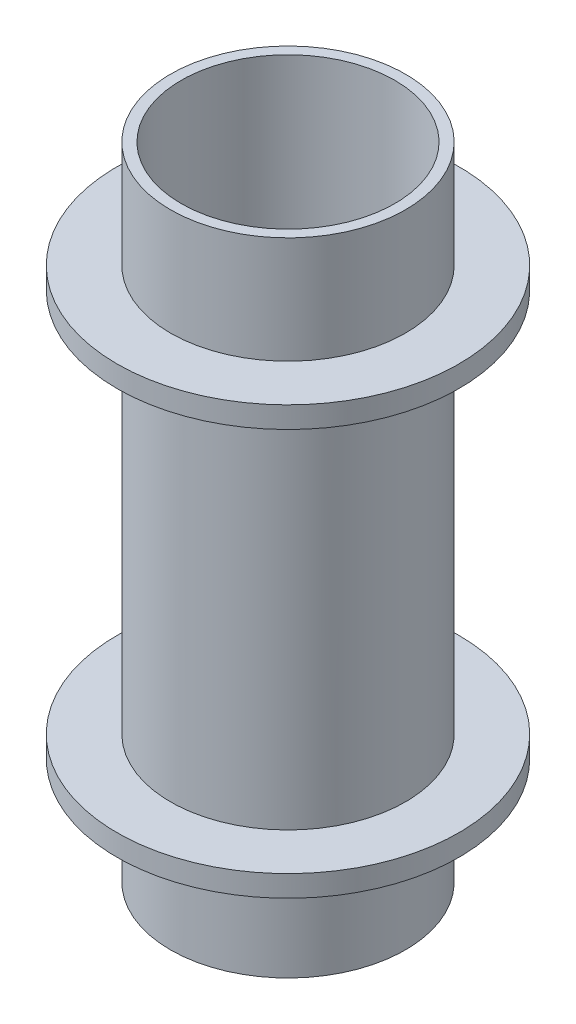
ISO-10303-21;
HEADER;
FILE_DESCRIPTION(('STEP AP214'),'2;1');
FILE_NAME('part.step','',(''),(''),'','','');
FILE_SCHEMA(('AUTOMOTIVE_DESIGN { 1 0 10303 214 1 1 1 1 }'));
ENDSEC;
DATA;
#1=APPLICATION_CONTEXT('core data for automotive mechanical design processes');
#2=APPLICATION_PROTOCOL_DEFINITION('international standard','automotive_design',2000,#1);
#3=PRODUCT_CONTEXT('',#1,'mechanical');
#4=PRODUCT('Part','Part','',(#3));
#5=PRODUCT_RELATED_PRODUCT_CATEGORY('part','',(#4));
#6=PRODUCT_DEFINITION_FORMATION('','',#4);
#7=PRODUCT_DEFINITION_CONTEXT('part definition',#1,'design');
#8=PRODUCT_DEFINITION('design','',#6,#7);
#9=PRODUCT_DEFINITION_SHAPE('','',#8);
#10=(LENGTH_UNIT() NAMED_UNIT(*) SI_UNIT(.MILLI.,.METRE.));
#11=(NAMED_UNIT(*) PLANE_ANGLE_UNIT() SI_UNIT($,.RADIAN.));
#12=(NAMED_UNIT(*) SI_UNIT($,.STERADIAN.) SOLID_ANGLE_UNIT());
#13=UNCERTAINTY_MEASURE_WITH_UNIT(LENGTH_MEASURE(1.E-05),#10,'distance_accuracy_value','');
#14=(GEOMETRIC_REPRESENTATION_CONTEXT(3) GLOBAL_UNCERTAINTY_ASSIGNED_CONTEXT((#13)) GLOBAL_UNIT_ASSIGNED_CONTEXT((#10,
#11,#12)) REPRESENTATION_CONTEXT('',''));
#15=CARTESIAN_POINT('',(0.,0.,0.));
#16=DIRECTION('',(0.,0.,1.));
#17=DIRECTION('',(1.,0.,0.));
#18=AXIS2_PLACEMENT_3D('',#15,#16,#17);
#19=CARTESIAN_POINT('',(0.,60.,0.));
#20=DIRECTION('',(0.,-1.,0.));
#21=DIRECTION('',(0.,0.,-1.));
#22=AXIS2_PLACEMENT_3D('',#19,#20,#21);
#23=CYLINDRICAL_SURFACE('',#22,11.);
#24=CARTESIAN_POINT('',(0.,48.,0.));
#25=DIRECTION('',(0.,1.,0.));
#26=DIRECTION('',(0.,0.,1.));
#27=AXIS2_PLACEMENT_3D('',#24,#25,#26);
#28=CIRCLE('',#27,11.);
#29=CARTESIAN_POINT('',(0.,48.,11.));
#30=VERTEX_POINT('',#29);
#31=EDGE_CURVE('E53',#30,#30,#28,.T.);
#32=ORIENTED_EDGE('',*,*,#31,.F.);
#33=EDGE_LOOP('',(#32));
#34=FACE_BOUND('',#33,.T.);
#35=CARTESIAN_POINT('',(0.,12.,0.));
#36=DIRECTION('',(0.,-1.,0.));
#37=DIRECTION('',(0.,0.,-1.));
#38=AXIS2_PLACEMENT_3D('',#35,#36,#37);
#39=CIRCLE('',#38,11.);
#40=CARTESIAN_POINT('',(0.,12.,-11.));
#41=VERTEX_POINT('',#40);
#42=EDGE_CURVE('E12',#41,#41,#39,.T.);
#43=ORIENTED_EDGE('',*,*,#42,.F.);
#44=EDGE_LOOP('',(#43));
#45=FACE_BOUND('',#44,.T.);
#46=ADVANCED_FACE('F46',(#34,#45),#23,.T.);
#47=CARTESIAN_POINT('',(0.,10.,0.));
#48=DIRECTION('',(0.,-1.,0.));
#49=DIRECTION('',(0.,0.,-1.));
#50=AXIS2_PLACEMENT_3D('',#47,#48,#49);
#51=CIRCLE('',#50,11.);
#52=CARTESIAN_POINT('',(0.,10.,-11.));
#53=VERTEX_POINT('',#52);
#54=EDGE_CURVE('E85',#53,#53,#51,.T.);
#55=ORIENTED_EDGE('',*,*,#54,.T.);
#56=EDGE_LOOP('',(#55));
#57=FACE_BOUND('',#56,.T.);
#58=CARTESIAN_POINT('',(0.,0.,0.));
#59=DIRECTION('',(0.,1.,0.));
#60=DIRECTION('',(0.,0.,1.));
#61=AXIS2_PLACEMENT_3D('',#58,#59,#60);
#62=CIRCLE('',#61,11.);
#63=CARTESIAN_POINT('',(0.,0.,11.));
#64=VERTEX_POINT('',#63);
#65=EDGE_CURVE('E61',#64,#64,#62,.T.);
#66=ORIENTED_EDGE('',*,*,#65,.T.);
#67=EDGE_LOOP('',(#66));
#68=FACE_BOUND('',#67,.T.);
#69=ADVANCED_FACE('F91',(#57,#68),#23,.T.);
#70=CARTESIAN_POINT('',(0.,60.,0.));
#71=DIRECTION('',(0.,1.,0.));
#72=DIRECTION('',(0.,0.,1.));
#73=AXIS2_PLACEMENT_3D('',#70,#71,#72);
#74=PLANE('',#73);
#75=CARTESIAN_POINT('',(0.,60.,0.));
#76=DIRECTION('',(0.,1.,0.));
#77=DIRECTION('',(0.,0.,1.));
#78=AXIS2_PLACEMENT_3D('',#75,#76,#77);
#79=CIRCLE('',#78,11.);
#80=CARTESIAN_POINT('',(0.,60.,11.));
#81=VERTEX_POINT('',#80);
#82=EDGE_CURVE('E57',#81,#81,#79,.T.);
#83=ORIENTED_EDGE('',*,*,#82,.T.);
#84=EDGE_LOOP('',(#83));
#85=FACE_BOUND('',#84,.T.);
#86=CARTESIAN_POINT('',(0.,60.,0.));
#87=DIRECTION('',(0.,1.,0.));
#88=DIRECTION('',(0.,0.,1.));
#89=AXIS2_PLACEMENT_3D('',#86,#87,#88);
#90=CIRCLE('',#89,10.);
#91=CARTESIAN_POINT('',(0.,60.,10.));
#92=VERTEX_POINT('',#91);
#93=EDGE_CURVE('E65',#92,#92,#90,.T.);
#94=ORIENTED_EDGE('',*,*,#93,.F.);
#95=EDGE_LOOP('',(#94));
#96=FACE_BOUND('',#95,.T.);
#97=ADVANCED_FACE('F120',(#85,#96),#74,.T.);
#98=CARTESIAN_POINT('',(0.,0.,0.));
#99=DIRECTION('',(0.,1.,0.));
#100=DIRECTION('',(0.,0.,1.));
#101=AXIS2_PLACEMENT_3D('',#98,#99,#100);
#102=PLANE('',#101);
#103=ORIENTED_EDGE('',*,*,#65,.F.);
#104=EDGE_LOOP('',(#103));
#105=FACE_BOUND('',#104,.T.);
#106=CARTESIAN_POINT('',(0.,0.,0.));
#107=DIRECTION('',(0.,1.,0.));
#108=DIRECTION('',(0.,0.,1.));
#109=AXIS2_PLACEMENT_3D('',#106,#107,#108);
#110=CIRCLE('',#109,10.);
#111=CARTESIAN_POINT('',(0.,0.,10.));
#112=VERTEX_POINT('',#111);
#113=EDGE_CURVE('E67',#112,#112,#110,.T.);
#114=ORIENTED_EDGE('',*,*,#113,.T.);
#115=EDGE_LOOP('',(#114));
#116=FACE_BOUND('',#115,.T.);
#117=ADVANCED_FACE('F124',(#105,#116),#102,.F.);
#118=CARTESIAN_POINT('',(0.,50.,0.));
#119=DIRECTION('',(0.,1.,0.));
#120=DIRECTION('',(0.,0.,1.));
#121=AXIS2_PLACEMENT_3D('',#118,#119,#120);
#122=CIRCLE('',#121,11.);
#123=CARTESIAN_POINT('',(0.,50.,11.));
#124=VERTEX_POINT('',#123);
#125=EDGE_CURVE('E76',#124,#124,#122,.T.);
#126=ORIENTED_EDGE('',*,*,#125,.T.);
#127=EDGE_LOOP('',(#126));
#128=FACE_BOUND('',#127,.T.);
#129=ORIENTED_EDGE('',*,*,#82,.F.);
#130=EDGE_LOOP('',(#129));
#131=FACE_BOUND('',#130,.T.);
#132=ADVANCED_FACE('F48',(#128,#131),#23,.T.);
#133=CARTESIAN_POINT('',(0.,60.,0.));
#134=DIRECTION('',(0.,-1.,0.));
#135=DIRECTION('',(0.,0.,-1.));
#136=AXIS2_PLACEMENT_3D('',#133,#134,#135);
#137=CYLINDRICAL_SURFACE('',#136,10.);
#138=ORIENTED_EDGE('',*,*,#93,.T.);
#139=EDGE_LOOP('',(#138));
#140=FACE_BOUND('',#139,.T.);
#141=ORIENTED_EDGE('',*,*,#113,.F.);
#142=EDGE_LOOP('',(#141));
#143=FACE_BOUND('',#142,.T.);
#144=ADVANCED_FACE('F123',(#140,#143),#137,.F.);
#145=CARTESIAN_POINT('',(0.,48.,0.));
#146=DIRECTION('',(0.,1.,0.));
#147=DIRECTION('',(0.,0.,1.));
#148=AXIS2_PLACEMENT_3D('',#145,#146,#147);
#149=CYLINDRICAL_SURFACE('',#148,16.);
#150=CARTESIAN_POINT('',(0.,48.,0.));
#151=DIRECTION('',(0.,1.,0.));
#152=DIRECTION('',(0.,0.,1.));
#153=AXIS2_PLACEMENT_3D('',#150,#151,#152);
#154=CIRCLE('',#153,16.);
#155=CARTESIAN_POINT('',(0.,48.,16.));
#156=VERTEX_POINT('',#155);
#157=EDGE_CURVE('E70',#156,#156,#154,.T.);
#158=ORIENTED_EDGE('',*,*,#157,.T.);
#159=EDGE_LOOP('',(#158));
#160=FACE_BOUND('',#159,.T.);
#161=CARTESIAN_POINT('',(0.,50.,0.));
#162=DIRECTION('',(0.,1.,0.));
#163=DIRECTION('',(0.,0.,1.));
#164=AXIS2_PLACEMENT_3D('',#161,#162,#163);
#165=CIRCLE('',#164,16.);
#166=CARTESIAN_POINT('',(0.,50.,16.));
#167=VERTEX_POINT('',#166);
#168=EDGE_CURVE('E73',#167,#167,#165,.T.);
#169=ORIENTED_EDGE('',*,*,#168,.F.);
#170=EDGE_LOOP('',(#169));
#171=FACE_BOUND('',#170,.T.);
#172=ADVANCED_FACE('F130',(#160,#171),#149,.T.);
#173=CARTESIAN_POINT('',(0.,48.,0.));
#174=DIRECTION('',(0.,1.,0.));
#175=DIRECTION('',(0.,0.,1.));
#176=AXIS2_PLACEMENT_3D('',#173,#174,#175);
#177=PLANE('',#176);
#178=ORIENTED_EDGE('',*,*,#31,.T.);
#179=EDGE_LOOP('',(#178));
#180=FACE_BOUND('',#179,.T.);
#181=ORIENTED_EDGE('',*,*,#157,.F.);
#182=EDGE_LOOP('',(#181));
#183=FACE_BOUND('',#182,.T.);
#184=ADVANCED_FACE('F111',(#180,#183),#177,.F.);
#185=CARTESIAN_POINT('',(0.,50.,0.));
#186=DIRECTION('',(0.,1.,0.));
#187=DIRECTION('',(0.,0.,1.));
#188=AXIS2_PLACEMENT_3D('',#185,#186,#187);
#189=PLANE('',#188);
#190=ORIENTED_EDGE('',*,*,#125,.F.);
#191=EDGE_LOOP('',(#190));
#192=FACE_BOUND('',#191,.T.);
#193=ORIENTED_EDGE('',*,*,#168,.T.);
#194=EDGE_LOOP('',(#193));
#195=FACE_BOUND('',#194,.T.);
#196=ADVANCED_FACE('F103',(#192,#195),#189,.T.);
#197=CARTESIAN_POINT('',(0.,12.,0.));
#198=DIRECTION('',(0.,-1.,0.));
#199=DIRECTION('',(0.,0.,-1.));
#200=AXIS2_PLACEMENT_3D('',#197,#198,#199);
#201=CYLINDRICAL_SURFACE('',#200,16.);
#202=CARTESIAN_POINT('',(0.,12.,0.));
#203=DIRECTION('',(0.,-1.,0.));
#204=DIRECTION('',(0.,0.,-1.));
#205=AXIS2_PLACEMENT_3D('',#202,#203,#204);
#206=CIRCLE('',#205,16.);
#207=CARTESIAN_POINT('',(0.,12.,-16.));
#208=VERTEX_POINT('',#207);
#209=EDGE_CURVE('E81',#208,#208,#206,.T.);
#210=ORIENTED_EDGE('',*,*,#209,.T.);
#211=EDGE_LOOP('',(#210));
#212=FACE_BOUND('',#211,.T.);
#213=CARTESIAN_POINT('',(0.,10.,0.));
#214=DIRECTION('',(0.,-1.,0.));
#215=DIRECTION('',(0.,0.,-1.));
#216=AXIS2_PLACEMENT_3D('',#213,#214,#215);
#217=CIRCLE('',#216,16.);
#218=CARTESIAN_POINT('',(0.,10.,-16.));
#219=VERTEX_POINT('',#218);
#220=EDGE_CURVE('E82',#219,#219,#217,.T.);
#221=ORIENTED_EDGE('',*,*,#220,.F.);
#222=EDGE_LOOP('',(#221));
#223=FACE_BOUND('',#222,.T.);
#224=ADVANCED_FACE('F101',(#212,#223),#201,.T.);
#225=CARTESIAN_POINT('',(0.,12.,0.));
#226=DIRECTION('',(0.,-1.,0.));
#227=DIRECTION('',(0.,0.,-1.));
#228=AXIS2_PLACEMENT_3D('',#225,#226,#227);
#229=PLANE('',#228);
#230=ORIENTED_EDGE('',*,*,#42,.T.);
#231=EDGE_LOOP('',(#230));
#232=FACE_BOUND('',#231,.T.);
#233=ORIENTED_EDGE('',*,*,#209,.F.);
#234=EDGE_LOOP('',(#233));
#235=FACE_BOUND('',#234,.T.);
#236=ADVANCED_FACE('F97',(#232,#235),#229,.F.);
#237=CARTESIAN_POINT('',(0.,10.,0.));
#238=DIRECTION('',(0.,-1.,0.));
#239=DIRECTION('',(0.,0.,-1.));
#240=AXIS2_PLACEMENT_3D('',#237,#238,#239);
#241=PLANE('',#240);
#242=ORIENTED_EDGE('',*,*,#54,.F.);
#243=EDGE_LOOP('',(#242));
#244=FACE_BOUND('',#243,.T.);
#245=ORIENTED_EDGE('',*,*,#220,.T.);
#246=EDGE_LOOP('',(#245));
#247=FACE_BOUND('',#246,.T.);
#248=ADVANCED_FACE('F94',(#244,#247),#241,.T.);
#249=CLOSED_SHELL('',(#46,#69,#97,#117,#132,#144,#172,#184,#196,#224,#236,#248));
#250=MANIFOLD_SOLID_BREP('B2',#249);
#251=ADVANCED_BREP_SHAPE_REPRESENTATION('',(#18,#250),#14);
#252=SHAPE_DEFINITION_REPRESENTATION(#9,#251);
ENDSEC;
END-ISO-10303-21;
